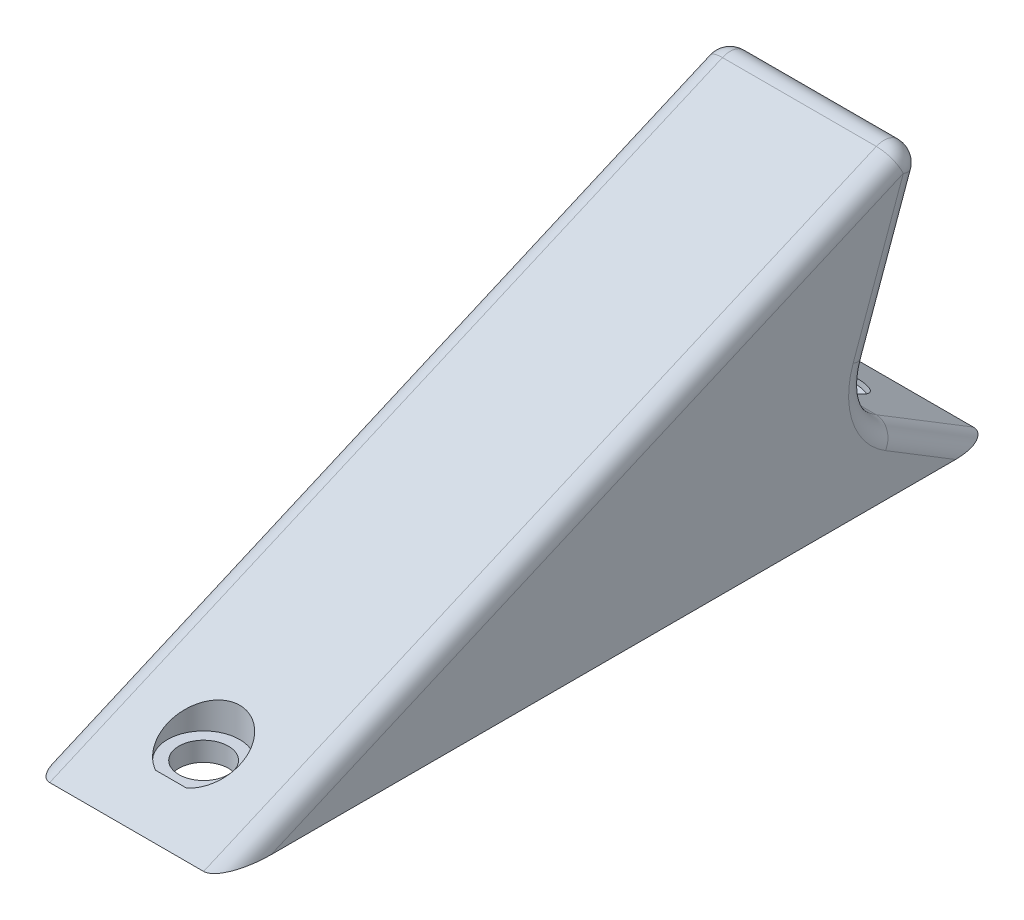
ISO-10303-21;
HEADER;
FILE_DESCRIPTION(('STEP AP214'),'2;1');
FILE_NAME('part.step','',(''),(''),'','','');
FILE_SCHEMA(('AUTOMOTIVE_DESIGN { 1 0 10303 214 1 1 1 1 }'));
ENDSEC;
DATA;
#1=APPLICATION_CONTEXT('core data for automotive mechanical design processes');
#2=APPLICATION_PROTOCOL_DEFINITION('international standard','automotive_design',2000,#1);
#3=PRODUCT_CONTEXT('',#1,'mechanical');
#4=PRODUCT('Part','Part','',(#3));
#5=PRODUCT_RELATED_PRODUCT_CATEGORY('part','',(#4));
#6=PRODUCT_DEFINITION_FORMATION('','',#4);
#7=PRODUCT_DEFINITION_CONTEXT('part definition',#1,'design');
#8=PRODUCT_DEFINITION('design','',#6,#7);
#9=PRODUCT_DEFINITION_SHAPE('','',#8);
#10=(LENGTH_UNIT() NAMED_UNIT(*) SI_UNIT(.MILLI.,.METRE.));
#11=(NAMED_UNIT(*) PLANE_ANGLE_UNIT() SI_UNIT($,.RADIAN.));
#12=(NAMED_UNIT(*) SI_UNIT($,.STERADIAN.) SOLID_ANGLE_UNIT());
#13=UNCERTAINTY_MEASURE_WITH_UNIT(LENGTH_MEASURE(1.E-05),#10,'distance_accuracy_value','');
#14=(GEOMETRIC_REPRESENTATION_CONTEXT(3) GLOBAL_UNCERTAINTY_ASSIGNED_CONTEXT((#13)) GLOBAL_UNIT_ASSIGNED_CONTEXT((#10,
#11,#12)) REPRESENTATION_CONTEXT('',''));
#15=CARTESIAN_POINT('',(0.,0.,0.));
#16=DIRECTION('',(0.,0.,1.));
#17=DIRECTION('',(1.,0.,0.));
#18=AXIS2_PLACEMENT_3D('',#15,#16,#17);
#19=CARTESIAN_POINT('',(25.4,0.,50.8));
#20=DIRECTION('',(0.,-0.917570589503571,-0.397572903098375));
#21=DIRECTION('',(0.,0.397572903098375,-0.917570589503571));
#22=AXIS2_PLACEMENT_3D('',#19,#20,#21);
#23=PLANE('',#22);
#24=DIRECTION('',(-1.,0.,0.));
#25=VECTOR('',#24,1.);
#26=CARTESIAN_POINT('',(25.4,2.54,44.9378567825524));
#27=LINE('',#26,#25);
#28=CARTESIAN_POINT('',(14.7517878366605,2.54,44.9378567825524));
#29=VERTEX_POINT('',#28);
#30=CARTESIAN_POINT('',(10.6482121633395,2.54,44.9378567825524));
#31=VERTEX_POINT('',#30);
#32=EDGE_CURVE('E135',#29,#31,#27,.T.);
#33=ORIENTED_EDGE('',*,*,#32,.T.);
#34=CARTESIAN_POINT('',(12.7,4.40221247464445,40.64));
#35=DIRECTION('',(0.,-0.917570589503571,-0.397572903098375));
#36=DIRECTION('',(0.,-0.397572903098375,0.917570589503571));
#37=AXIS2_PLACEMENT_3D('',#34,#35,#36);
#38=ELLIPSE('',#37,5.19033636701089,4.7625);
#39=EDGE_CURVE('E11',#31,#29,#38,.T.);
#40=ORIENTED_EDGE('',*,*,#39,.T.);
#41=EDGE_LOOP('',(#33,#40));
#42=FACE_BOUND('',#41,.T.);
#43=DIRECTION('',(-1.,0.,0.));
#44=VECTOR('',#43,1.);
#45=CARTESIAN_POINT('',(25.4,38.4772290060621,-38.0027665527808));
#46=LINE('',#45,#44);
#47=CARTESIAN_POINT('',(22.86,38.4772290060621,-38.0027665527808));
#48=VERTEX_POINT('',#47);
#49=CARTESIAN_POINT('',(2.54,38.4772290060621,-38.0027665527808));
#50=VERTEX_POINT('',#49);
#51=EDGE_CURVE('E151',#48,#50,#46,.T.);
#52=ORIENTED_EDGE('',*,*,#51,.T.);
#53=DIRECTION('',(0.,-0.397572903098375,0.917570589503571));
#54=VECTOR('',#53,1.);
#55=CARTESIAN_POINT('',(2.54,0.,50.8));
#56=LINE('',#55,#54);
#57=CARTESIAN_POINT('',(2.54,0.,50.8));
#58=VERTEX_POINT('',#57);
#59=EDGE_CURVE('E154',#50,#58,#56,.T.);
#60=ORIENTED_EDGE('',*,*,#59,.T.);
#61=DIRECTION('',(-1.,0.,0.));
#62=VECTOR('',#61,1.);
#63=CARTESIAN_POINT('',(25.4,0.,50.8));
#64=LINE('',#63,#62);
#65=CARTESIAN_POINT('',(22.86,0.,50.8));
#66=VERTEX_POINT('',#65);
#67=EDGE_CURVE('E331',#66,#58,#64,.T.);
#68=ORIENTED_EDGE('',*,*,#67,.F.);
#69=DIRECTION('',(0.,-0.397572903098375,0.917570589503571));
#70=VECTOR('',#69,1.);
#71=CARTESIAN_POINT('',(22.86,0.,50.8));
#72=LINE('',#71,#70);
#73=EDGE_CURVE('E157',#66,#48,#72,.F.);
#74=ORIENTED_EDGE('',*,*,#73,.T.);
#75=EDGE_LOOP('',(#52,#60,#68,#74));
#76=FACE_BOUND('',#75,.T.);
#77=ADVANCED_FACE('F42',(#42,#76),#23,.F.);
#78=CARTESIAN_POINT('',(25.4,0.,50.8));
#79=DIRECTION('',(0.,1.,0.));
#80=DIRECTION('',(0.,0.,1.));
#81=AXIS2_PLACEMENT_3D('',#78,#79,#80);
#82=PLANE('',#81);
#83=CARTESIAN_POINT('',(12.7,0.,40.64));
#84=DIRECTION('',(0.,-1.,0.));
#85=DIRECTION('',(0.,0.,-1.));
#86=AXIS2_PLACEMENT_3D('',#83,#84,#85);
#87=CIRCLE('',#86,3.26390000000001);
#88=CARTESIAN_POINT('',(12.7,0.,37.3761));
#89=VERTEX_POINT('',#88);
#90=EDGE_CURVE('E192',#89,#89,#87,.T.);
#91=ORIENTED_EDGE('',*,*,#90,.F.);
#92=EDGE_LOOP('',(#91));
#93=FACE_BOUND('',#92,.T.);
#94=CARTESIAN_POINT('',(12.7,0.,-40.64));
#95=DIRECTION('',(0.,-1.,0.));
#96=DIRECTION('',(0.,0.,-1.));
#97=AXIS2_PLACEMENT_3D('',#94,#95,#96);
#98=CIRCLE('',#97,3.2639);
#99=CARTESIAN_POINT('',(12.7,0.,-43.9039));
#100=VERTEX_POINT('',#99);
#101=EDGE_CURVE('E257',#100,#100,#98,.T.);
#102=ORIENTED_EDGE('',*,*,#101,.F.);
#103=EDGE_LOOP('',(#102));
#104=FACE_BOUND('',#103,.T.);
#105=DIRECTION('',(0.,0.,-1.));
#106=VECTOR('',#105,1.);
#107=CARTESIAN_POINT('',(0.,0.,50.8));
#108=LINE('',#107,#106);
#109=CARTESIAN_POINT('',(0.,0.,44.4112346183424));
#110=VERTEX_POINT('',#109);
#111=CARTESIAN_POINT('',(0.,0.,-45.921893147079));
#112=VERTEX_POINT('',#111);
#113=EDGE_CURVE('E180',#110,#112,#108,.T.);
#114=ORIENTED_EDGE('',*,*,#113,.T.);
#115=CARTESIAN_POINT('',(2.54,0.,-45.921893147079));
#116=DIRECTION('',(0.,1.,0.));
#117=DIRECTION('',(0.,0.,-1.));
#118=AXIS2_PLACEMENT_3D('',#115,#116,#117);
#119=ELLIPSE('',#118,4.87810685292099,2.54);
#120=CARTESIAN_POINT('',(2.54,0.,-50.8));
#121=VERTEX_POINT('',#120);
#122=EDGE_CURVE('E261',#112,#121,#119,.F.);
#123=ORIENTED_EDGE('',*,*,#122,.T.);
#124=DIRECTION('',(-1.,0.,0.));
#125=VECTOR('',#124,1.);
#126=CARTESIAN_POINT('',(25.4,0.,-50.8));
#127=LINE('',#126,#125);
#128=CARTESIAN_POINT('',(22.86,0.,-50.8));
#129=VERTEX_POINT('',#128);
#130=EDGE_CURVE('E335',#129,#121,#127,.T.);
#131=ORIENTED_EDGE('',*,*,#130,.F.);
#132=CARTESIAN_POINT('',(22.86,0.,-45.921893147079));
#133=DIRECTION('',(0.,1.,0.));
#134=DIRECTION('',(0.,0.,1.));
#135=AXIS2_PLACEMENT_3D('',#132,#133,#134);
#136=ELLIPSE('',#135,4.87810685292099,2.54);
#137=CARTESIAN_POINT('',(25.4,0.,-45.921893147079));
#138=VERTEX_POINT('',#137);
#139=EDGE_CURVE('E272',#129,#138,#136,.F.);
#140=ORIENTED_EDGE('',*,*,#139,.T.);
#141=DIRECTION('',(0.,0.,-1.));
#142=VECTOR('',#141,1.);
#143=CARTESIAN_POINT('',(25.4,0.,50.8));
#144=LINE('',#143,#142);
#145=CARTESIAN_POINT('',(25.4,0.,44.4112346183424));
#146=VERTEX_POINT('',#145);
#147=EDGE_CURVE('E183',#146,#138,#144,.T.);
#148=ORIENTED_EDGE('',*,*,#147,.F.);
#149=CARTESIAN_POINT('',(22.86,0.,44.4112346183424));
#150=DIRECTION('',(0.,1.,0.));
#151=DIRECTION('',(0.,0.,1.));
#152=AXIS2_PLACEMENT_3D('',#149,#150,#151);
#153=ELLIPSE('',#152,6.38876538165758,2.54);
#154=EDGE_CURVE('E328',#146,#66,#153,.F.);
#155=ORIENTED_EDGE('',*,*,#154,.T.);
#156=ORIENTED_EDGE('',*,*,#67,.T.);
#157=CARTESIAN_POINT('',(2.54,0.,44.4112346183424));
#158=DIRECTION('',(0.,1.,0.));
#159=DIRECTION('',(0.,0.,-1.));
#160=AXIS2_PLACEMENT_3D('',#157,#158,#159);
#161=ELLIPSE('',#160,6.38876538165758,2.54);
#162=EDGE_CURVE('E171',#58,#110,#161,.F.);
#163=ORIENTED_EDGE('',*,*,#162,.T.);
#164=EDGE_LOOP('',(#114,#123,#131,#140,#148,#155,#156,#163));
#165=FACE_BOUND('',#164,.T.);
#166=ADVANCED_FACE('F147',(#93,#104,#165),#82,.F.);
#167=CARTESIAN_POINT('',(25.4,11.0506628824822,-32.6810371954736));
#168=DIRECTION('',(0.,-0.853743500925239,0.520693801219024));
#169=DIRECTION('',(0.,-0.520693801219024,-0.853743500925239));
#170=AXIS2_PLACEMENT_3D('',#167,#168,#169);
#171=PLANE('',#170);
#172=DIRECTION('',(-1.,0.,0.));
#173=VECTOR('',#172,1.);
#174=CARTESIAN_POINT('',(25.4,7.81394854778502,-37.9880406995098));
#175=LINE('',#174,#173);
#176=CARTESIAN_POINT('',(2.54,7.81394854778502,-37.9880406995098));
#177=VERTEX_POINT('',#176);
#178=CARTESIAN_POINT('',(8.74417921051225,7.81394854778502,-37.9880406995098));
#179=VERTEX_POINT('',#178);
#180=EDGE_CURVE('E161',#177,#179,#175,.F.);
#181=ORIENTED_EDGE('',*,*,#180,.T.);
#182=CARTESIAN_POINT('',(12.7,6.19653211374613,-40.64));
#183=DIRECTION('',(0.,-0.853743500925239,0.520693801219024));
#184=DIRECTION('',(0.,-0.520693801219024,-0.853743500925239));
#185=AXIS2_PLACEMENT_3D('',#182,#183,#184);
#186=ELLIPSE('',#185,5.57837335785124,4.7625);
#187=CARTESIAN_POINT('',(16.6558207894878,7.81394854778502,-37.9880406995098));
#188=VERTEX_POINT('',#187);
#189=EDGE_CURVE('E63',#179,#188,#186,.T.);
#190=ORIENTED_EDGE('',*,*,#189,.T.);
#191=CARTESIAN_POINT('',(22.86,7.81394854778502,-37.9880406995098));
#192=VERTEX_POINT('',#191);
#193=EDGE_CURVE('E349',#188,#192,#175,.F.);
#194=ORIENTED_EDGE('',*,*,#193,.T.);
#195=DIRECTION('',(0.,0.520693801219024,0.853743500925239));
#196=VECTOR('',#195,1.);
#197=CARTESIAN_POINT('',(22.86,11.0506628824822,-32.6810371954736));
#198=LINE('',#197,#196);
#199=EDGE_CURVE('E317',#192,#129,#198,.F.);
#200=ORIENTED_EDGE('',*,*,#199,.T.);
#201=ORIENTED_EDGE('',*,*,#130,.T.);
#202=DIRECTION('',(0.,0.520693801219024,0.853743500925239));
#203=VECTOR('',#202,1.);
#204=CARTESIAN_POINT('',(2.54,7.81394854778502,-37.9880406995098));
#205=LINE('',#204,#203);
#206=EDGE_CURVE('E270',#121,#177,#205,.T.);
#207=ORIENTED_EDGE('',*,*,#206,.T.);
#208=EDGE_LOOP('',(#181,#190,#194,#200,#201,#207));
#209=FACE_BOUND('',#208,.T.);
#210=ADVANCED_FACE('F242',(#209),#171,.F.);
#211=CARTESIAN_POINT('',(25.4,40.8118437978473,-43.3908950043621));
#212=DIRECTION('',(0.,0.338602827926463,0.9409293942269));
#213=DIRECTION('',(0.,-0.9409293942269,0.338602827926463));
#214=AXIS2_PLACEMENT_3D('',#211,#212,#213);
#215=PLANE('',#214);
#216=DIRECTION('',(-1.,0.,0.));
#217=VECTOR('',#216,1.);
#218=CARTESIAN_POINT('',(0.,16.899627573635,-34.7858454807898));
#219=LINE('',#218,#217);
#220=CARTESIAN_POINT('',(22.86,16.899627573635,-34.7858454807898));
#221=VERTEX_POINT('',#220);
#222=CARTESIAN_POINT('',(2.54,16.899627573635,-34.7858454807898));
#223=VERTEX_POINT('',#222);
#224=EDGE_CURVE('E314',#221,#223,#219,.T.);
#225=ORIENTED_EDGE('',*,*,#224,.T.);
#226=DIRECTION('',(0.,0.9409293942269,-0.338602827926463));
#227=VECTOR('',#226,1.);
#228=CARTESIAN_POINT('',(2.54,35.2865485257898,-41.402562387987));
#229=LINE('',#228,#227);
#230=CARTESIAN_POINT('',(2.54,35.2865485257898,-41.402562387987));
#231=VERTEX_POINT('',#230);
#232=EDGE_CURVE('E283',#223,#231,#229,.T.);
#233=ORIENTED_EDGE('',*,*,#232,.T.);
#234=DIRECTION('',(-1.,0.,0.));
#235=VECTOR('',#234,1.);
#236=CARTESIAN_POINT('',(25.4,35.2865485257898,-41.402562387987));
#237=LINE('',#236,#235);
#238=CARTESIAN_POINT('',(22.86,35.2865485257898,-41.402562387987));
#239=VERTEX_POINT('',#238);
#240=EDGE_CURVE('E160',#231,#239,#237,.F.);
#241=ORIENTED_EDGE('',*,*,#240,.T.);
#242=DIRECTION('',(0.,0.9409293942269,-0.338602827926463));
#243=VECTOR('',#242,1.);
#244=CARTESIAN_POINT('',(22.86,40.8118437978473,-43.3908950043621));
#245=LINE('',#244,#243);
#246=EDGE_CURVE('E281',#239,#221,#245,.F.);
#247=ORIENTED_EDGE('',*,*,#246,.T.);
#248=EDGE_LOOP('',(#225,#233,#241,#247));
#249=FACE_BOUND('',#248,.T.);
#250=ADVANCED_FACE('F235',(#249),#215,.F.);
#251=CARTESIAN_POINT('',(25.4,0.,0.));
#252=DIRECTION('',(-1.,0.,0.));
#253=DIRECTION('',(0.,0.,1.));
#254=AXIS2_PLACEMENT_3D('',#251,#252,#253);
#255=PLANE('',#254);
#256=ORIENTED_EDGE('',*,*,#147,.T.);
#257=DIRECTION('',(0.,0.520693801219024,0.853743500925239));
#258=VECTOR('',#257,1.);
#259=CARTESIAN_POINT('',(25.4,20.4140701048001,-12.4504371040018));
#260=LINE('',#259,#258);
#261=CARTESIAN_POINT('',(25.4,5.64544005543491,-36.6654784444135));
#262=VERTEX_POINT('',#261);
#263=EDGE_CURVE('E294',#138,#262,#260,.T.);
#264=ORIENTED_EDGE('',*,*,#263,.T.);
#265=CARTESIAN_POINT('',(25.4,14.3194740248353,-41.9557274647988));
#266=DIRECTION('',(-1.,0.,0.));
#267=DIRECTION('',(0.,0.,1.));
#268=AXIS2_PLACEMENT_3D('',#265,#266,#267);
#269=CIRCLE('',#268,10.16);
#270=CARTESIAN_POINT('',(25.4,17.7596787565682,-32.3958848194534));
#271=VERTEX_POINT('',#270);
#272=EDGE_CURVE('E292',#262,#271,#269,.T.);
#273=ORIENTED_EDGE('',*,*,#272,.T.);
#274=DIRECTION('',(0.,0.9409293942269,-0.338602827926463));
#275=VECTOR('',#274,1.);
#276=CARTESIAN_POINT('',(25.4,-8.28519228961683,-23.0233781857711));
#277=LINE('',#276,#275);
#278=CARTESIAN_POINT('',(25.4,36.146599708723,-39.0126017266507));
#279=VERTEX_POINT('',#278);
#280=EDGE_CURVE('E290',#271,#279,#277,.T.);
#281=ORIENTED_EDGE('',*,*,#280,.T.);
#282=DIRECTION('',(0.,-0.397572903098375,0.917570589503571));
#283=VECTOR('',#282,1.);
#284=CARTESIAN_POINT('',(25.4,16.2012718184453,7.01982686065606));
#285=LINE('',#284,#283);
#286=EDGE_CURVE('E288',#279,#146,#285,.T.);
#287=ORIENTED_EDGE('',*,*,#286,.T.);
#288=EDGE_LOOP('',(#256,#264,#273,#281,#287));
#289=FACE_BOUND('',#288,.T.);
#290=ADVANCED_FACE('F231',(#289),#255,.F.);
#291=CARTESIAN_POINT('',(0.,0.,0.));
#292=DIRECTION('',(-1.,0.,0.));
#293=DIRECTION('',(0.,0.,1.));
#294=AXIS2_PLACEMENT_3D('',#291,#292,#293);
#295=PLANE('',#294);
#296=CARTESIAN_POINT('',(0.,14.3194740248353,-41.9557274647988));
#297=DIRECTION('',(-1.,0.,0.));
#298=DIRECTION('',(0.,0.,1.));
#299=AXIS2_PLACEMENT_3D('',#296,#297,#298);
#300=CIRCLE('',#299,10.16);
#301=CARTESIAN_POINT('',(0.,17.7596787565682,-32.3958848194534));
#302=VERTEX_POINT('',#301);
#303=CARTESIAN_POINT('',(0.,5.64544005543491,-36.6654784444135));
#304=VERTEX_POINT('',#303);
#305=EDGE_CURVE('E304',#302,#304,#300,.F.);
#306=ORIENTED_EDGE('',*,*,#305,.T.);
#307=DIRECTION('',(0.,0.520693801219024,0.853743500925239));
#308=VECTOR('',#307,1.);
#309=CARTESIAN_POINT('',(0.,-2.16850849235011,-49.4774377449037));
#310=LINE('',#309,#308);
#311=EDGE_CURVE('E267',#304,#112,#310,.F.);
#312=ORIENTED_EDGE('',*,*,#311,.T.);
#313=ORIENTED_EDGE('',*,*,#113,.F.);
#314=DIRECTION('',(0.,-0.397572903098375,0.917570589503571));
#315=VECTOR('',#314,1.);
#316=CARTESIAN_POINT('',(0.,36.1465997087231,-39.0126017266507));
#317=LINE('',#316,#315);
#318=CARTESIAN_POINT('',(0.,36.146599708723,-39.0126017266507));
#319=VERTEX_POINT('',#318);
#320=EDGE_CURVE('E323',#110,#319,#317,.F.);
#321=ORIENTED_EDGE('',*,*,#320,.T.);
#322=DIRECTION('',(0.,0.9409293942269,-0.338602827926463));
#323=VECTOR('',#322,1.);
#324=CARTESIAN_POINT('',(0.,17.7596787565682,-32.3958848194534));
#325=LINE('',#324,#323);
#326=EDGE_CURVE('E308',#319,#302,#325,.F.);
#327=ORIENTED_EDGE('',*,*,#326,.T.);
#328=EDGE_LOOP('',(#306,#312,#313,#321,#327));
#329=FACE_BOUND('',#328,.T.);
#330=ADVANCED_FACE('F234',(#329),#295,.T.);
#331=CARTESIAN_POINT('',(25.4,14.3194740248353,-41.9557274647988));
#332=DIRECTION('',(1.,0.,0.));
#333=DIRECTION('',(0.,0.,-1.));
#334=AXIS2_PLACEMENT_3D('',#331,#332,#333);
#335=CYLINDRICAL_SURFACE('',#334,7.62);
#336=ORIENTED_EDGE('',*,*,#193,.F.);
#337=CARTESIAN_POINT('',(16.6558207894878,7.81394854778502,-37.9880406995098));
#338=CARTESIAN_POINT('',(16.5715049351165,7.89059922847772,-37.8623272127972));
#339=CARTESIAN_POINT('',(16.4818615557974,7.96930240638528,-37.7415124453259));
#340=CARTESIAN_POINT('',(16.2925054715123,8.12928712377033,-37.5098611804371));
#341=CARTESIAN_POINT('',(16.1927918865357,8.21056888815776,-37.3990255566762));
#342=CARTESIAN_POINT('',(15.98293028048,8.37492658154668,-37.18655768261));
#343=CARTESIAN_POINT('',(15.8726943015271,8.45801215092122,-37.0850200089999));
#344=CARTESIAN_POINT('',(15.6428529703816,8.62346094344966,-36.8925347442114));
#345=CARTESIAN_POINT('',(15.5232494053343,8.70582430106904,-36.8015851412364));
#346=CARTESIAN_POINT('',(15.3034082982043,8.84902370013729,-36.6503736421929));
#347=CARTESIAN_POINT('',(15.2050787280583,8.9104378563442,-36.5878758447388));
#348=CARTESIAN_POINT('',(15.0027636363952,9.03046152852451,-36.4695772990066));
#349=CARTESIAN_POINT('',(14.8987764323774,9.08907020033777,-36.4137785589283));
#350=CARTESIAN_POINT('',(14.6854155015423,9.2018626392025,-36.3094601909756));
#351=CARTESIAN_POINT('',(14.5760614426142,9.25606087351782,-36.2609162875848));
#352=CARTESIAN_POINT('',(14.3516329112737,9.35853497177003,-36.17142879463));
#353=CARTESIAN_POINT('',(14.2365588196802,9.40681122923048,-36.1304846999552));
#354=CARTESIAN_POINT('',(13.9564290082114,9.5120393357701,-36.0430923384136));
#355=CARTESIAN_POINT('',(13.7887919692861,9.56547123530618,-36.000323531838));
#356=CARTESIAN_POINT('',(13.5309412488804,9.62978934247636,-35.9497304220582));
#357=CARTESIAN_POINT('',(13.4439594884925,9.64858627250866,-35.9351290512391));
#358=CARTESIAN_POINT('',(13.2682742078981,9.68025104387189,-35.9106954289933));
#359=CARTESIAN_POINT('',(13.1795714801004,9.69312154949616,-35.9008610344118));
#360=CARTESIAN_POINT('',(13.0003007603696,9.71247864305213,-35.886119168658));
#361=CARTESIAN_POINT('',(12.9097233609479,9.71891073072159,-35.8812537522595));
#362=CARTESIAN_POINT('',(12.7282111098651,9.72490495820964,-35.8767185126554));
#363=CARTESIAN_POINT('',(12.6372762723316,9.72446736686996,-35.8770484861305));
#364=CARTESIAN_POINT('',(12.4558395070586,9.71674147188659,-35.882896520521));
#365=CARTESIAN_POINT('',(12.3653377320961,9.70945090736169,-35.8884162936162));
#366=CARTESIAN_POINT('',(12.1855196743551,9.68834757206009,-35.9045092436108));
#367=CARTESIAN_POINT('',(12.0962040322237,9.67453141313525,-35.9150850456814));
#368=CARTESIAN_POINT('',(11.9079780772357,9.63877860811119,-35.9427363095679));
#369=CARTESIAN_POINT('',(11.8093211602235,9.61602271112491,-35.960475578882));
#370=CARTESIAN_POINT('',(11.6149517904959,9.56396295130096,-36.0016852055235));
#371=CARTESIAN_POINT('',(11.5192414476693,9.53465451514571,-36.0251595667012));
#372=CARTESIAN_POINT('',(11.2367575960313,9.43846134382242,-36.1036403686309));
#373=CARTESIAN_POINT('',(11.0549362324723,9.36337276916108,-36.1666575988466));
#374=CARTESIAN_POINT('',(10.7500512689748,9.22033992903885,-36.2926977594779));
#375=CARTESIAN_POINT('',(10.6237748164618,9.15540808249288,-36.3516715373238));
#376=CARTESIAN_POINT('',(10.3788782080417,9.02042822065495,-36.4791294139779));
#377=CARTESIAN_POINT('',(10.2602621032603,8.95037753936791,-36.5476184855255));
#378=CARTESIAN_POINT('',(10.0305764240561,8.80723142341918,-36.6935946621765));
#379=CARTESIAN_POINT('',(9.91951089207736,8.73413439105153,-36.7710865280081));
#380=CARTESIAN_POINT('',(9.70496673439027,8.58661650855653,-36.9346830611873));
#381=CARTESIAN_POINT('',(9.60148575042112,8.51219607893249,-37.020785031542));
#382=CARTESIAN_POINT('',(9.3590054765306,8.3311929738692,-37.2405445121534));
#383=CARTESIAN_POINT('',(9.22398645517939,8.22461208780945,-37.378671273333));
#384=CARTESIAN_POINT('',(9.03421132186475,8.06773781819543,-37.5981747736872));
#385=CARTESIAN_POINT('',(8.97318486358545,8.01604352481893,-37.673237008846));
#386=CARTESIAN_POINT('',(8.85541882442282,7.91393692273263,-37.8275257679963));
#387=CARTESIAN_POINT('',(8.79868051841931,7.86352499820694,-37.9067535186287));
#388=CARTESIAN_POINT('',(8.74417921051225,7.81394854778502,-37.9880406995098));
#389=B_SPLINE_CURVE_WITH_KNOTS('',3,(#337,#338,#339,#340,#341,#342,#343,#344,#345,#346,#347,
#348,#349,#350,#351,#352,#353,#354,#355,#356,#357,#358,#359,#360,#361,#362,#363,#364,#365,#366,
#367,#368,#369,#370,#371,#372,#373,#374,#375,#376,#377,#378,#379,#380,#381,#382,#383,#384,#385,
#386,#387,#388),.UNSPECIFIED.,.F.,.F.,(4,2,2,2,2,2,2,2,2,2,2,2,2,2,2,2,2,2,2,2,2,2,2,2,2,4),(0.,
0.508769717609046,1.01758393389622,1.53110296887319,2.04452427236764,2.43935444765108,
2.83430268858267,3.22789828269767,3.62146770765707,4.16240312319158,4.43266506786054,
4.70280539420695,4.97521355723535,5.24761105972159,5.52009846108964,5.79272749618833,
6.100622887857,6.40873384844246,7.02588936541822,7.48663307189656,7.9476184774522,
8.408848773884,8.86993504635692,9.5303144292611,9.85922754788805,10.1882380717585),.UNSPECIFIED.);
#390=EDGE_CURVE('E50',#188,#179,#389,.T.);
#391=ORIENTED_EDGE('',*,*,#390,.T.);
#392=ORIENTED_EDGE('',*,*,#180,.F.);
#393=CARTESIAN_POINT('',(2.54,14.3194740248353,-41.9557274647988));
#394=DIRECTION('',(-1.,0.,0.));
#395=DIRECTION('',(0.,0.,1.));
#396=AXIS2_PLACEMENT_3D('',#393,#394,#395);
#397=CIRCLE('',#396,7.62);
#398=EDGE_CURVE('E275',#177,#223,#397,.T.);
#399=ORIENTED_EDGE('',*,*,#398,.T.);
#400=ORIENTED_EDGE('',*,*,#224,.F.);
#401=CARTESIAN_POINT('',(22.86,14.3194740248353,-41.9557274647988));
#402=DIRECTION('',(-1.,0.,0.));
#403=DIRECTION('',(0.,0.,1.));
#404=AXIS2_PLACEMENT_3D('',#401,#402,#403);
#405=CIRCLE('',#404,7.62);
#406=EDGE_CURVE('E271',#221,#192,#405,.F.);
#407=ORIENTED_EDGE('',*,*,#406,.T.);
#408=EDGE_LOOP('',(#336,#391,#392,#399,#400,#407));
#409=FACE_BOUND('',#408,.T.);
#410=ADVANCED_FACE('F211',(#409),#335,.F.);
#411=CARTESIAN_POINT('',(25.4,36.146599708723,-39.0126017266507));
#412=DIRECTION('',(-1.,0.,0.));
#413=DIRECTION('',(0.,0.,1.));
#414=AXIS2_PLACEMENT_3D('',#411,#412,#413);
#415=CYLINDRICAL_SURFACE('',#414,2.54);
#416=ORIENTED_EDGE('',*,*,#240,.F.);
#417=CARTESIAN_POINT('',(2.54,36.146599708723,-39.0126017266507));
#418=DIRECTION('',(-1.,0.,0.));
#419=DIRECTION('',(0.,0.,1.));
#420=AXIS2_PLACEMENT_3D('',#417,#418,#419);
#421=CIRCLE('',#420,2.54);
#422=EDGE_CURVE('E176',#231,#50,#421,.F.);
#423=ORIENTED_EDGE('',*,*,#422,.T.);
#424=ORIENTED_EDGE('',*,*,#51,.F.);
#425=CARTESIAN_POINT('',(22.86,36.146599708723,-39.0126017266507));
#426=DIRECTION('',(-1.,0.,0.));
#427=DIRECTION('',(0.,0.,1.));
#428=AXIS2_PLACEMENT_3D('',#425,#426,#427);
#429=CIRCLE('',#428,2.54);
#430=EDGE_CURVE('E285',#48,#239,#429,.T.);
#431=ORIENTED_EDGE('',*,*,#430,.T.);
#432=EDGE_LOOP('',(#416,#423,#424,#431));
#433=FACE_BOUND('',#432,.T.);
#434=ADVANCED_FACE('F315',(#433),#415,.T.);
#435=CARTESIAN_POINT('',(2.54,-2.33062929733907,49.7901648261301));
#436=DIRECTION('',(0.,0.397572903098375,-0.917570589503571));
#437=DIRECTION('',(0.,0.917570589503571,0.397572903098375));
#438=AXIS2_PLACEMENT_3D('',#435,#436,#437);
#439=CYLINDRICAL_SURFACE('',#438,2.54);
#440=ORIENTED_EDGE('',*,*,#162,.F.);
#441=ORIENTED_EDGE('',*,*,#59,.F.);
#442=CARTESIAN_POINT('',(2.54,36.146599708723,-39.0126017266507));
#443=DIRECTION('',(0.,0.397572903098369,-0.917570589503573));
#444=DIRECTION('',(0.,0.917570589503573,0.397572903098369));
#445=AXIS2_PLACEMENT_3D('',#442,#443,#444);
#446=CIRCLE('',#445,2.54);
#447=EDGE_CURVE('E169',#319,#50,#446,.T.);
#448=ORIENTED_EDGE('',*,*,#447,.F.);
#449=ORIENTED_EDGE('',*,*,#320,.F.);
#450=EDGE_LOOP('',(#440,#441,#448,#449));
#451=FACE_BOUND('',#450,.T.);
#452=ADVANCED_FACE('F167',(#451),#439,.T.);
#453=CARTESIAN_POINT('',(2.54,36.146599708723,-39.0126017266507));
#454=DIRECTION('',(-1.,0.,0.));
#455=DIRECTION('',(0.,0.,1.));
#456=AXIS2_PLACEMENT_3D('',#453,#454,#455);
#457=SPHERICAL_SURFACE('',#456,2.54);
#458=ORIENTED_EDGE('',*,*,#447,.T.);
#459=ORIENTED_EDGE('',*,*,#422,.F.);
#460=CARTESIAN_POINT('',(2.54,36.146599708723,-39.0126017266507));
#461=DIRECTION('',(0.,-0.940929394226901,0.338602827926463));
#462=DIRECTION('',(0.,-0.338602827926463,-0.940929394226901));
#463=AXIS2_PLACEMENT_3D('',#460,#461,#462);
#464=CIRCLE('',#463,2.54);
#465=EDGE_CURVE('E178',#319,#231,#464,.T.);
#466=ORIENTED_EDGE('',*,*,#465,.F.);
#467=EDGE_LOOP('',(#458,#459,#466));
#468=FACE_BOUND('',#467,.T.);
#469=ADVANCED_FACE('F175',(#468),#457,.T.);
#470=CARTESIAN_POINT('',(2.54,41.6718949807805,-41.0009343430257));
#471=DIRECTION('',(0.,-0.9409293942269,0.338602827926463));
#472=DIRECTION('',(0.,-0.338602827926463,-0.9409293942269));
#473=AXIS2_PLACEMENT_3D('',#470,#471,#472);
#474=CYLINDRICAL_SURFACE('',#473,2.54);
#475=ORIENTED_EDGE('',*,*,#465,.T.);
#476=ORIENTED_EDGE('',*,*,#232,.F.);
#477=CARTESIAN_POINT('',(2.54,17.7596787565682,-32.3958848194534));
#478=DIRECTION('',(0.,-0.940929394226901,0.338602827926463));
#479=DIRECTION('',(0.,-0.338602827926463,-0.940929394226901));
#480=AXIS2_PLACEMENT_3D('',#477,#478,#479);
#481=CIRCLE('',#480,2.54);
#482=EDGE_CURVE('E185',#302,#223,#481,.T.);
#483=ORIENTED_EDGE('',*,*,#482,.F.);
#484=ORIENTED_EDGE('',*,*,#326,.F.);
#485=EDGE_LOOP('',(#475,#476,#483,#484));
#486=FACE_BOUND('',#485,.T.);
#487=ADVANCED_FACE('F307',(#486),#474,.T.);
#488=CARTESIAN_POINT('',(2.54,14.3194740248353,-41.9557274647988));
#489=DIRECTION('',(-1.,0.,0.));
#490=DIRECTION('',(0.,0.,1.));
#491=AXIS2_PLACEMENT_3D('',#488,#489,#490);
#492=TOROIDAL_SURFACE('',#491,10.16,2.54);
#493=ORIENTED_EDGE('',*,*,#482,.T.);
#494=ORIENTED_EDGE('',*,*,#398,.F.);
#495=CARTESIAN_POINT('',(2.54,5.64544005543491,-36.6654784444135));
#496=DIRECTION('',(0.,-0.520693801219023,-0.85374350092524));
#497=DIRECTION('',(0.,0.85374350092524,-0.520693801219023));
#498=AXIS2_PLACEMENT_3D('',#495,#496,#497);
#499=CIRCLE('',#498,2.54);
#500=EDGE_CURVE('E201',#304,#177,#499,.T.);
#501=ORIENTED_EDGE('',*,*,#500,.F.);
#502=ORIENTED_EDGE('',*,*,#305,.F.);
#503=EDGE_LOOP('',(#493,#494,#501,#502));
#504=FACE_BOUND('',#503,.T.);
#505=ADVANCED_FACE('F303',(#504),#492,.T.);
#506=CARTESIAN_POINT('',(2.54,8.88215439013214,-31.3584749403772));
#507=DIRECTION('',(0.,-0.520693801219024,-0.853743500925239));
#508=DIRECTION('',(0.,0.853743500925239,-0.520693801219024));
#509=AXIS2_PLACEMENT_3D('',#506,#507,#508);
#510=CYLINDRICAL_SURFACE('',#509,2.54);
#511=ORIENTED_EDGE('',*,*,#122,.F.);
#512=ORIENTED_EDGE('',*,*,#311,.F.);
#513=ORIENTED_EDGE('',*,*,#500,.T.);
#514=ORIENTED_EDGE('',*,*,#206,.F.);
#515=EDGE_LOOP('',(#511,#512,#513,#514));
#516=FACE_BOUND('',#515,.T.);
#517=ADVANCED_FACE('F266',(#516),#510,.T.);
#518=CARTESIAN_POINT('',(22.86,16.2012718184453,7.01982686065606));
#519=DIRECTION('',(0.,-0.397572903098375,0.917570589503571));
#520=DIRECTION('',(0.,-0.917570589503571,-0.397572903098375));
#521=AXIS2_PLACEMENT_3D('',#518,#519,#520);
#522=CYLINDRICAL_SURFACE('',#521,2.54);
#523=CARTESIAN_POINT('',(22.86,36.1465997087231,-39.0126017266507));
#524=DIRECTION('',(0.,0.397572903098374,-0.917570589503571));
#525=DIRECTION('',(0.,0.917570589503571,0.397572903098374));
#526=AXIS2_PLACEMENT_3D('',#523,#524,#525);
#527=CIRCLE('',#526,2.54);
#528=EDGE_CURVE('E198',#48,#279,#527,.T.);
#529=ORIENTED_EDGE('',*,*,#528,.F.);
#530=ORIENTED_EDGE('',*,*,#73,.F.);
#531=ORIENTED_EDGE('',*,*,#154,.F.);
#532=ORIENTED_EDGE('',*,*,#286,.F.);
#533=EDGE_LOOP('',(#529,#530,#531,#532));
#534=FACE_BOUND('',#533,.T.);
#535=ADVANCED_FACE('F44',(#534),#522,.T.);
#536=CARTESIAN_POINT('',(22.86,36.146599708723,-39.0126017266507));
#537=DIRECTION('',(-1.,0.,0.));
#538=DIRECTION('',(0.,0.,1.));
#539=AXIS2_PLACEMENT_3D('',#536,#537,#538);
#540=SPHERICAL_SURFACE('',#539,2.54);
#541=ORIENTED_EDGE('',*,*,#430,.F.);
#542=ORIENTED_EDGE('',*,*,#528,.T.);
#543=CARTESIAN_POINT('',(22.86,36.146599708723,-39.0126017266507));
#544=DIRECTION('',(0.,-0.940929394226901,0.338602827926463));
#545=DIRECTION('',(0.,-0.338602827926463,-0.940929394226901));
#546=AXIS2_PLACEMENT_3D('',#543,#544,#545);
#547=CIRCLE('',#546,2.54);
#548=EDGE_CURVE('E195',#239,#279,#547,.T.);
#549=ORIENTED_EDGE('',*,*,#548,.F.);
#550=EDGE_LOOP('',(#541,#542,#549));
#551=FACE_BOUND('',#550,.T.);
#552=ADVANCED_FACE('F338',(#551),#540,.T.);
#553=CARTESIAN_POINT('',(22.86,-8.28519228961683,-23.0233781857711));
#554=DIRECTION('',(0.,0.9409293942269,-0.338602827926463));
#555=DIRECTION('',(0.,0.338602827926463,0.9409293942269));
#556=AXIS2_PLACEMENT_3D('',#553,#554,#555);
#557=CYLINDRICAL_SURFACE('',#556,2.54);
#558=ORIENTED_EDGE('',*,*,#548,.T.);
#559=ORIENTED_EDGE('',*,*,#280,.F.);
#560=CARTESIAN_POINT('',(22.86,17.7596787565682,-32.3958848194534));
#561=DIRECTION('',(0.,-0.940929394226901,0.338602827926463));
#562=DIRECTION('',(0.,-0.338602827926463,-0.940929394226901));
#563=AXIS2_PLACEMENT_3D('',#560,#561,#562);
#564=CIRCLE('',#563,2.54);
#565=EDGE_CURVE('E191',#221,#271,#564,.T.);
#566=ORIENTED_EDGE('',*,*,#565,.F.);
#567=ORIENTED_EDGE('',*,*,#246,.F.);
#568=EDGE_LOOP('',(#558,#559,#566,#567));
#569=FACE_BOUND('',#568,.T.);
#570=ADVANCED_FACE('F343',(#569),#557,.T.);
#571=CARTESIAN_POINT('',(22.86,14.3194740248353,-41.9557274647988));
#572=DIRECTION('',(-1.,0.,0.));
#573=DIRECTION('',(0.,0.,1.));
#574=AXIS2_PLACEMENT_3D('',#571,#572,#573);
#575=TOROIDAL_SURFACE('',#574,10.16,2.54);
#576=ORIENTED_EDGE('',*,*,#565,.T.);
#577=ORIENTED_EDGE('',*,*,#272,.F.);
#578=CARTESIAN_POINT('',(22.86,5.64544005543492,-36.6654784444135));
#579=DIRECTION('',(0.,-0.520693801219023,-0.853743500925239));
#580=DIRECTION('',(0.,0.853743500925239,-0.520693801219023));
#581=AXIS2_PLACEMENT_3D('',#578,#579,#580);
#582=CIRCLE('',#581,2.54);
#583=EDGE_CURVE('E189',#192,#262,#582,.T.);
#584=ORIENTED_EDGE('',*,*,#583,.F.);
#585=ORIENTED_EDGE('',*,*,#406,.F.);
#586=EDGE_LOOP('',(#576,#577,#584,#585));
#587=FACE_BOUND('',#586,.T.);
#588=ADVANCED_FACE('F403',(#587),#575,.T.);
#589=CARTESIAN_POINT('',(22.86,20.4140701048001,-12.4504371040018));
#590=DIRECTION('',(0.,0.520693801219024,0.853743500925239));
#591=DIRECTION('',(0.,-0.853743500925239,0.520693801219024));
#592=AXIS2_PLACEMENT_3D('',#589,#590,#591);
#593=CYLINDRICAL_SURFACE('',#592,2.54);
#594=ORIENTED_EDGE('',*,*,#139,.F.);
#595=ORIENTED_EDGE('',*,*,#199,.F.);
#596=ORIENTED_EDGE('',*,*,#583,.T.);
#597=ORIENTED_EDGE('',*,*,#263,.F.);
#598=EDGE_LOOP('',(#594,#595,#596,#597));
#599=FACE_BOUND('',#598,.T.);
#600=ADVANCED_FACE('F229',(#599),#593,.T.);
#601=CARTESIAN_POINT('',(12.7,10.16,-40.64));
#602=DIRECTION('',(0.,-1.,0.));
#603=DIRECTION('',(0.,0.,-1.));
#604=AXIS2_PLACEMENT_3D('',#601,#602,#603);
#605=CYLINDRICAL_SURFACE('',#604,3.2639);
#606=CARTESIAN_POINT('',(12.7,2.54,-40.64));
#607=DIRECTION('',(0.,-1.,0.));
#608=DIRECTION('',(0.,0.,-1.));
#609=AXIS2_PLACEMENT_3D('',#606,#607,#608);
#610=CIRCLE('',#609,3.2639);
#611=CARTESIAN_POINT('',(12.7,2.54,-43.9039));
#612=VERTEX_POINT('',#611);
#613=EDGE_CURVE('E138',#612,#612,#610,.F.);
#614=ORIENTED_EDGE('',*,*,#613,.T.);
#615=EDGE_LOOP('',(#614));
#616=FACE_BOUND('',#615,.T.);
#617=ORIENTED_EDGE('',*,*,#101,.T.);
#618=EDGE_LOOP('',(#617));
#619=FACE_BOUND('',#618,.T.);
#620=ADVANCED_FACE('F225',(#616,#619),#605,.F.);
#621=CARTESIAN_POINT('',(12.7,10.16,40.64));
#622=DIRECTION('',(0.,-1.,0.));
#623=DIRECTION('',(0.,0.,-1.));
#624=AXIS2_PLACEMENT_3D('',#621,#622,#623);
#625=CYLINDRICAL_SURFACE('',#624,3.26390000000001);
#626=CARTESIAN_POINT('',(12.7,2.54,40.64));
#627=DIRECTION('',(0.,-1.,0.));
#628=DIRECTION('',(0.,0.,-1.));
#629=AXIS2_PLACEMENT_3D('',#626,#627,#628);
#630=CIRCLE('',#629,3.26390000000001);
#631=CARTESIAN_POINT('',(12.7,2.54,37.3761));
#632=VERTEX_POINT('',#631);
#633=EDGE_CURVE('E139',#632,#632,#630,.F.);
#634=ORIENTED_EDGE('',*,*,#633,.T.);
#635=EDGE_LOOP('',(#634));
#636=FACE_BOUND('',#635,.T.);
#637=ORIENTED_EDGE('',*,*,#90,.T.);
#638=EDGE_LOOP('',(#637));
#639=FACE_BOUND('',#638,.T.);
#640=ADVANCED_FACE('F222',(#636,#639),#625,.F.);
#641=CARTESIAN_POINT('',(12.7,12.7,40.64));
#642=DIRECTION('',(0.,-1.,0.));
#643=DIRECTION('',(0.,0.,-1.));
#644=AXIS2_PLACEMENT_3D('',#641,#642,#643);
#645=CYLINDRICAL_SURFACE('',#644,4.7625);
#646=CARTESIAN_POINT('',(12.7,2.54,40.64));
#647=DIRECTION('',(0.,-1.,0.));
#648=DIRECTION('',(0.,0.,-1.));
#649=AXIS2_PLACEMENT_3D('',#646,#647,#648);
#650=CIRCLE('',#649,4.7625);
#651=EDGE_CURVE('E56',#31,#29,#650,.T.);
#652=ORIENTED_EDGE('',*,*,#651,.T.);
#653=ORIENTED_EDGE('',*,*,#39,.F.);
#654=EDGE_LOOP('',(#652,#653));
#655=FACE_BOUND('',#654,.T.);
#656=ADVANCED_FACE('F142',(#655),#645,.F.);
#657=CARTESIAN_POINT('',(12.7,2.54,40.64));
#658=DIRECTION('',(0.,-1.,0.));
#659=DIRECTION('',(0.,0.,-1.));
#660=AXIS2_PLACEMENT_3D('',#657,#658,#659);
#661=PLANE('',#660);
#662=ORIENTED_EDGE('',*,*,#633,.F.);
#663=EDGE_LOOP('',(#662));
#664=FACE_BOUND('',#663,.T.);
#665=ORIENTED_EDGE('',*,*,#651,.F.);
#666=ORIENTED_EDGE('',*,*,#32,.F.);
#667=EDGE_LOOP('',(#665,#666));
#668=FACE_BOUND('',#667,.T.);
#669=ADVANCED_FACE('F136',(#664,#668),#661,.F.);
#670=CARTESIAN_POINT('',(12.7,12.7,-40.64));
#671=DIRECTION('',(0.,-1.,0.));
#672=DIRECTION('',(0.,0.,-1.));
#673=AXIS2_PLACEMENT_3D('',#670,#671,#672);
#674=CYLINDRICAL_SURFACE('',#673,4.7625);
#675=CARTESIAN_POINT('',(12.7,2.54,-40.64));
#676=DIRECTION('',(0.,-1.,0.));
#677=DIRECTION('',(0.,0.,-1.));
#678=AXIS2_PLACEMENT_3D('',#675,#676,#677);
#679=CIRCLE('',#678,4.7625);
#680=CARTESIAN_POINT('',(12.7,2.54,-45.4025));
#681=VERTEX_POINT('',#680);
#682=EDGE_CURVE('E143',#681,#681,#679,.T.);
#683=ORIENTED_EDGE('',*,*,#682,.T.);
#684=EDGE_LOOP('',(#683));
#685=FACE_BOUND('',#684,.T.);
#686=ORIENTED_EDGE('',*,*,#390,.F.);
#687=ORIENTED_EDGE('',*,*,#189,.F.);
#688=EDGE_LOOP('',(#686,#687));
#689=FACE_BOUND('',#688,.T.);
#690=ADVANCED_FACE('F214',(#685,#689),#674,.F.);
#691=CARTESIAN_POINT('',(12.7,2.54,-40.64));
#692=DIRECTION('',(0.,-1.,0.));
#693=DIRECTION('',(0.,0.,-1.));
#694=AXIS2_PLACEMENT_3D('',#691,#692,#693);
#695=PLANE('',#694);
#696=ORIENTED_EDGE('',*,*,#682,.F.);
#697=EDGE_LOOP('',(#696));
#698=FACE_BOUND('',#697,.T.);
#699=ORIENTED_EDGE('',*,*,#613,.F.);
#700=EDGE_LOOP('',(#699));
#701=FACE_BOUND('',#700,.T.);
#702=ADVANCED_FACE('F219',(#698,#701),#695,.F.);
#703=CLOSED_SHELL('',(#77,#166,#210,#250,#290,#330,#410,#434,#452,#469,#487,#505,#517,#535,#552,
#570,#588,#600,#620,#640,#656,#669,#690,#702));
#704=MANIFOLD_SOLID_BREP('B2',#703);
#705=ADVANCED_BREP_SHAPE_REPRESENTATION('',(#18,#704),#14);
#706=SHAPE_DEFINITION_REPRESENTATION(#9,#705);
ENDSEC;
END-ISO-10303-21;
